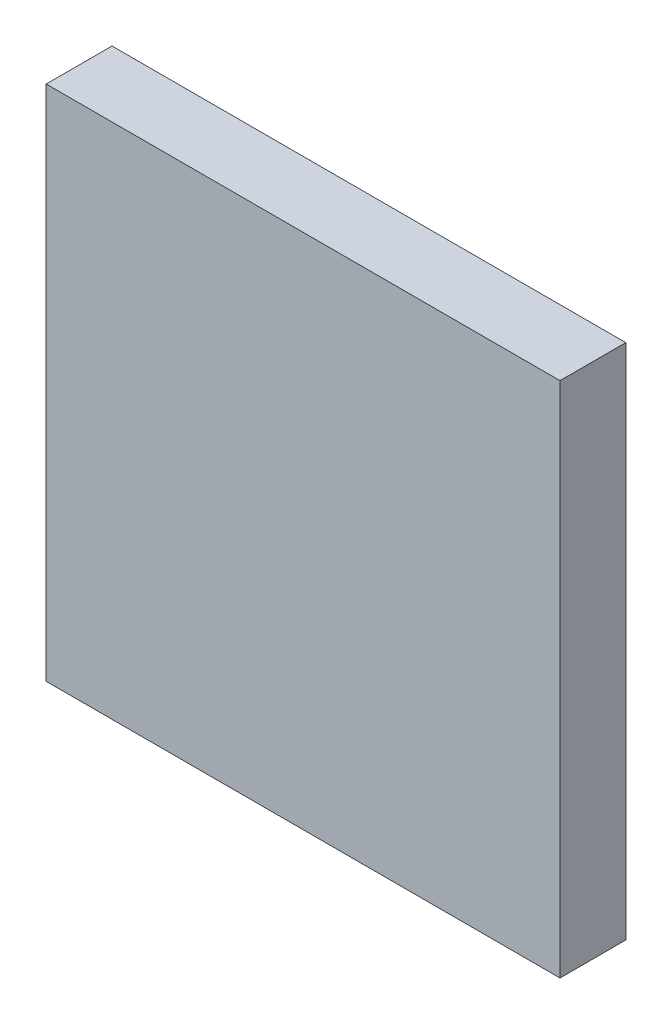
ISO-10303-21;
HEADER;
FILE_DESCRIPTION(('STEP AP214'),'2;1');
FILE_NAME('part.step','',(''),(''),'','','');
FILE_SCHEMA(('AUTOMOTIVE_DESIGN { 1 0 10303 214 1 1 1 1 }'));
ENDSEC;
DATA;
#1=APPLICATION_CONTEXT('core data for automotive mechanical design processes');
#2=APPLICATION_PROTOCOL_DEFINITION('international standard','automotive_design',2000,#1);
#3=PRODUCT_CONTEXT('',#1,'mechanical');
#4=PRODUCT('Part','Part','',(#3));
#5=PRODUCT_RELATED_PRODUCT_CATEGORY('part','',(#4));
#6=PRODUCT_DEFINITION_FORMATION('','',#4);
#7=PRODUCT_DEFINITION_CONTEXT('part definition',#1,'design');
#8=PRODUCT_DEFINITION('design','',#6,#7);
#9=PRODUCT_DEFINITION_SHAPE('','',#8);
#10=(LENGTH_UNIT() NAMED_UNIT(*) SI_UNIT(.MILLI.,.METRE.));
#11=(NAMED_UNIT(*) PLANE_ANGLE_UNIT() SI_UNIT($,.RADIAN.));
#12=(NAMED_UNIT(*) SI_UNIT($,.STERADIAN.) SOLID_ANGLE_UNIT());
#13=UNCERTAINTY_MEASURE_WITH_UNIT(LENGTH_MEASURE(1.E-05),#10,'distance_accuracy_value','');
#14=(GEOMETRIC_REPRESENTATION_CONTEXT(3) GLOBAL_UNCERTAINTY_ASSIGNED_CONTEXT((#13)) GLOBAL_UNIT_ASSIGNED_CONTEXT((#10,
#11,#12)) REPRESENTATION_CONTEXT('',''));
#15=CARTESIAN_POINT('',(0.,0.,0.));
#16=DIRECTION('',(0.,0.,1.));
#17=DIRECTION('',(1.,0.,0.));
#18=AXIS2_PLACEMENT_3D('',#15,#16,#17);
#19=CARTESIAN_POINT('',(0.,0.,1.));
#20=DIRECTION('',(0.,0.,1.));
#21=DIRECTION('',(1.,0.,0.));
#22=AXIS2_PLACEMENT_3D('',#19,#20,#21);
#23=PLANE('',#22);
#24=DIRECTION('',(1.,0.,0.));
#25=VECTOR('',#24,1.);
#26=CARTESIAN_POINT('',(3.6,3.6,1.));
#27=LINE('',#26,#25);
#28=CARTESIAN_POINT('',(-4.2082,3.6,1.));
#29=VERTEX_POINT('',#28);
#30=CARTESIAN_POINT('',(3.6,3.6,1.));
#31=VERTEX_POINT('',#30);
#32=EDGE_CURVE('E68',#29,#31,#27,.T.);
#33=ORIENTED_EDGE('',*,*,#32,.F.);
#34=DIRECTION('',(0.,1.,0.));
#35=VECTOR('',#34,1.);
#36=CARTESIAN_POINT('',(-4.2082,3.6,1.));
#37=LINE('',#36,#35);
#38=CARTESIAN_POINT('',(-4.2082,-4.2622,1.));
#39=VERTEX_POINT('',#38);
#40=EDGE_CURVE('E20',#39,#29,#37,.T.);
#41=ORIENTED_EDGE('',*,*,#40,.F.);
#42=DIRECTION('',(1.,0.,0.));
#43=VECTOR('',#42,1.);
#44=CARTESIAN_POINT('',(-4.2082,-4.2622,1.));
#45=LINE('',#44,#43);
#46=CARTESIAN_POINT('',(3.6,-4.2622,1.));
#47=VERTEX_POINT('',#46);
#48=EDGE_CURVE('E58',#47,#39,#45,.F.);
#49=ORIENTED_EDGE('',*,*,#48,.F.);
#50=DIRECTION('',(0.,1.,0.));
#51=VECTOR('',#50,1.);
#52=CARTESIAN_POINT('',(3.6,-4.2622,1.));
#53=LINE('',#52,#51);
#54=EDGE_CURVE('E53',#31,#47,#53,.F.);
#55=ORIENTED_EDGE('',*,*,#54,.F.);
#56=EDGE_LOOP('',(#33,#41,#49,#55));
#57=FACE_BOUND('',#56,.T.);
#58=ADVANCED_FACE('F17',(#57),#23,.T.);
#59=CARTESIAN_POINT('',(-4.2082,3.6,0.));
#60=DIRECTION('',(-1.,0.,0.));
#61=DIRECTION('',(0.,0.,1.));
#62=AXIS2_PLACEMENT_3D('',#59,#60,#61);
#63=PLANE('',#62);
#64=DIRECTION('',(0.,0.,1.));
#65=VECTOR('',#64,1.);
#66=CARTESIAN_POINT('',(-4.2082,3.6,0.));
#67=LINE('',#66,#65);
#68=CARTESIAN_POINT('',(-4.2082,3.6,0.));
#69=VERTEX_POINT('',#68);
#70=EDGE_CURVE('E79',#69,#29,#67,.T.);
#71=ORIENTED_EDGE('',*,*,#70,.F.);
#72=DIRECTION('',(0.,1.,0.));
#73=VECTOR('',#72,1.);
#74=CARTESIAN_POINT('',(-4.2082,0.,0.));
#75=LINE('',#74,#73);
#76=CARTESIAN_POINT('',(-4.2082,-4.2622,0.));
#77=VERTEX_POINT('',#76);
#78=EDGE_CURVE('E74',#69,#77,#75,.F.);
#79=ORIENTED_EDGE('',*,*,#78,.T.);
#80=DIRECTION('',(0.,0.,-1.));
#81=VECTOR('',#80,1.);
#82=CARTESIAN_POINT('',(-4.2082,-4.2622,0.));
#83=LINE('',#82,#81);
#84=EDGE_CURVE('E63',#39,#77,#83,.T.);
#85=ORIENTED_EDGE('',*,*,#84,.F.);
#86=ORIENTED_EDGE('',*,*,#40,.T.);
#87=EDGE_LOOP('',(#71,#79,#85,#86));
#88=FACE_BOUND('',#87,.T.);
#89=ADVANCED_FACE('F73',(#88),#63,.T.);
#90=CARTESIAN_POINT('',(-4.2082,-4.2622,0.));
#91=DIRECTION('',(0.,-1.,0.));
#92=DIRECTION('',(0.,0.,-1.));
#93=AXIS2_PLACEMENT_3D('',#90,#91,#92);
#94=PLANE('',#93);
#95=ORIENTED_EDGE('',*,*,#84,.T.);
#96=DIRECTION('',(1.,0.,0.));
#97=VECTOR('',#96,1.);
#98=CARTESIAN_POINT('',(0.,-4.2622,0.));
#99=LINE('',#98,#97);
#100=CARTESIAN_POINT('',(3.6,-4.2622,0.));
#101=VERTEX_POINT('',#100);
#102=EDGE_CURVE('E84',#77,#101,#99,.T.);
#103=ORIENTED_EDGE('',*,*,#102,.T.);
#104=DIRECTION('',(0.,0.,-1.));
#105=VECTOR('',#104,1.);
#106=CARTESIAN_POINT('',(3.6,-4.2622,0.));
#107=LINE('',#106,#105);
#108=EDGE_CURVE('E65',#47,#101,#107,.T.);
#109=ORIENTED_EDGE('',*,*,#108,.F.);
#110=ORIENTED_EDGE('',*,*,#48,.T.);
#111=EDGE_LOOP('',(#95,#103,#109,#110));
#112=FACE_BOUND('',#111,.T.);
#113=ADVANCED_FACE('F60',(#112),#94,.T.);
#114=CARTESIAN_POINT('',(3.6,-4.2622,0.));
#115=DIRECTION('',(1.,0.,0.));
#116=DIRECTION('',(0.,0.,-1.));
#117=AXIS2_PLACEMENT_3D('',#114,#115,#116);
#118=PLANE('',#117);
#119=ORIENTED_EDGE('',*,*,#108,.T.);
#120=DIRECTION('',(0.,1.,0.));
#121=VECTOR('',#120,1.);
#122=CARTESIAN_POINT('',(3.6,0.,0.));
#123=LINE('',#122,#121);
#124=CARTESIAN_POINT('',(3.6,3.6,0.));
#125=VERTEX_POINT('',#124);
#126=EDGE_CURVE('E26',#101,#125,#123,.T.);
#127=ORIENTED_EDGE('',*,*,#126,.T.);
#128=DIRECTION('',(0.,0.,1.));
#129=VECTOR('',#128,1.);
#130=CARTESIAN_POINT('',(3.6,3.6,0.));
#131=LINE('',#130,#129);
#132=EDGE_CURVE('E34',#31,#125,#131,.F.);
#133=ORIENTED_EDGE('',*,*,#132,.F.);
#134=ORIENTED_EDGE('',*,*,#54,.T.);
#135=EDGE_LOOP('',(#119,#127,#133,#134));
#136=FACE_BOUND('',#135,.T.);
#137=ADVANCED_FACE('F88',(#136),#118,.T.);
#138=CARTESIAN_POINT('',(3.6,3.6,0.));
#139=DIRECTION('',(0.,1.,0.));
#140=DIRECTION('',(0.,0.,1.));
#141=AXIS2_PLACEMENT_3D('',#138,#139,#140);
#142=PLANE('',#141);
#143=ORIENTED_EDGE('',*,*,#132,.T.);
#144=DIRECTION('',(1.,0.,0.));
#145=VECTOR('',#144,1.);
#146=CARTESIAN_POINT('',(0.,3.6,0.));
#147=LINE('',#146,#145);
#148=EDGE_CURVE('E11',#125,#69,#147,.F.);
#149=ORIENTED_EDGE('',*,*,#148,.T.);
#150=ORIENTED_EDGE('',*,*,#70,.T.);
#151=ORIENTED_EDGE('',*,*,#32,.T.);
#152=EDGE_LOOP('',(#143,#149,#150,#151));
#153=FACE_BOUND('',#152,.T.);
#154=ADVANCED_FACE('F91',(#153),#142,.T.);
#155=CARTESIAN_POINT('',(0.,0.,0.));
#156=DIRECTION('',(0.,0.,1.));
#157=DIRECTION('',(1.,0.,0.));
#158=AXIS2_PLACEMENT_3D('',#155,#156,#157);
#159=PLANE('',#158);
#160=ORIENTED_EDGE('',*,*,#126,.F.);
#161=ORIENTED_EDGE('',*,*,#102,.F.);
#162=ORIENTED_EDGE('',*,*,#78,.F.);
#163=ORIENTED_EDGE('',*,*,#148,.F.);
#164=EDGE_LOOP('',(#160,#161,#162,#163));
#165=FACE_BOUND('',#164,.T.);
#166=ADVANCED_FACE('F90',(#165),#159,.F.);
#167=CLOSED_SHELL('',(#58,#89,#113,#137,#154,#166));
#168=MANIFOLD_SOLID_BREP('B1',#167);
#169=ADVANCED_BREP_SHAPE_REPRESENTATION('',(#18,#168),#14);
#170=SHAPE_DEFINITION_REPRESENTATION(#9,#169);
ENDSEC;
END-ISO-10303-21;
